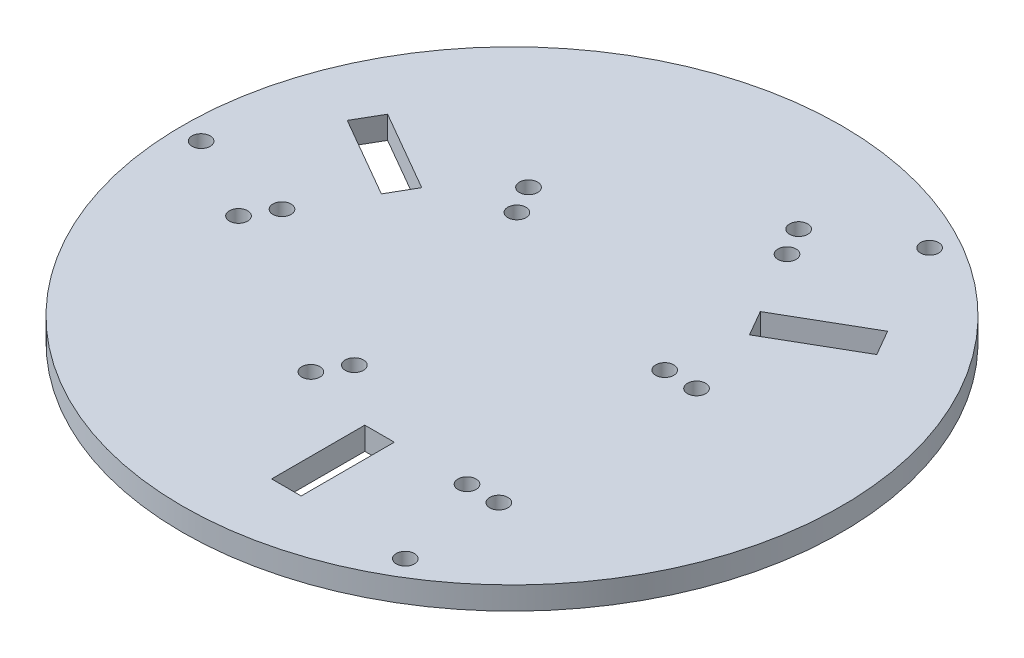
ISO-10303-21;
HEADER;
FILE_DESCRIPTION(('STEP AP214'),'2;1');
FILE_NAME('part.step','',(''),(''),'','','');
FILE_SCHEMA(('AUTOMOTIVE_DESIGN { 1 0 10303 214 1 1 1 1 }'));
ENDSEC;
DATA;
#1=APPLICATION_CONTEXT('core data for automotive mechanical design processes');
#2=APPLICATION_PROTOCOL_DEFINITION('international standard','automotive_design',2000,#1);
#3=PRODUCT_CONTEXT('',#1,'mechanical');
#4=PRODUCT('Part','Part','',(#3));
#5=PRODUCT_RELATED_PRODUCT_CATEGORY('part','',(#4));
#6=PRODUCT_DEFINITION_FORMATION('','',#4);
#7=PRODUCT_DEFINITION_CONTEXT('part definition',#1,'design');
#8=PRODUCT_DEFINITION('design','',#6,#7);
#9=PRODUCT_DEFINITION_SHAPE('','',#8);
#10=(LENGTH_UNIT() NAMED_UNIT(*) SI_UNIT(.MILLI.,.METRE.));
#11=(NAMED_UNIT(*) PLANE_ANGLE_UNIT() SI_UNIT($,.RADIAN.));
#12=(NAMED_UNIT(*) SI_UNIT($,.STERADIAN.) SOLID_ANGLE_UNIT());
#13=UNCERTAINTY_MEASURE_WITH_UNIT(LENGTH_MEASURE(1.E-05),#10,'distance_accuracy_value','');
#14=(GEOMETRIC_REPRESENTATION_CONTEXT(3) GLOBAL_UNCERTAINTY_ASSIGNED_CONTEXT((#13)) GLOBAL_UNIT_ASSIGNED_CONTEXT((#10,
#11,#12)) REPRESENTATION_CONTEXT('',''));
#15=CARTESIAN_POINT('',(0.,0.,0.));
#16=DIRECTION('',(0.,0.,1.));
#17=DIRECTION('',(1.,0.,0.));
#18=AXIS2_PLACEMENT_3D('',#15,#16,#17);
#19=CARTESIAN_POINT('',(0.,5.,0.));
#20=DIRECTION('',(0.,-1.,0.));
#21=DIRECTION('',(0.,0.,-1.));
#22=AXIS2_PLACEMENT_3D('',#19,#20,#21);
#23=CYLINDRICAL_SURFACE('',#22,72.5);
#24=CARTESIAN_POINT('',(0.,5.,0.));
#25=DIRECTION('',(0.,1.,0.));
#26=DIRECTION('',(0.,0.,1.));
#27=AXIS2_PLACEMENT_3D('',#24,#25,#26);
#28=CIRCLE('',#27,72.5);
#29=CARTESIAN_POINT('',(0.,5.,72.5));
#30=VERTEX_POINT('',#29);
#31=EDGE_CURVE('E11',#30,#30,#28,.T.);
#32=ORIENTED_EDGE('',*,*,#31,.F.);
#33=EDGE_LOOP('',(#32));
#34=FACE_BOUND('',#33,.T.);
#35=CARTESIAN_POINT('',(0.,0.,0.));
#36=DIRECTION('',(0.,1.,0.));
#37=DIRECTION('',(0.,0.,1.));
#38=AXIS2_PLACEMENT_3D('',#35,#36,#37);
#39=CIRCLE('',#38,72.5);
#40=CARTESIAN_POINT('',(0.,0.,72.5));
#41=VERTEX_POINT('',#40);
#42=EDGE_CURVE('E48',#41,#41,#39,.T.);
#43=ORIENTED_EDGE('',*,*,#42,.T.);
#44=EDGE_LOOP('',(#43));
#45=FACE_BOUND('',#44,.T.);
#46=ADVANCED_FACE('F45',(#34,#45),#23,.T.);
#47=CARTESIAN_POINT('',(0.,5.,0.));
#48=DIRECTION('',(0.,1.,0.));
#49=DIRECTION('',(0.,0.,1.));
#50=AXIS2_PLACEMENT_3D('',#47,#48,#49);
#51=PLANE('',#50);
#52=CARTESIAN_POINT('',(-67.4939627960778,5.,0.902765795580199));
#53=DIRECTION('',(0.,1.,0.));
#54=DIRECTION('',(0.866025403784436,0.,-0.500000000000004));
#55=AXIS2_PLACEMENT_3D('',#52,#53,#54);
#56=CIRCLE('',#55,2.00000000000001);
#57=CARTESIAN_POINT('',(-65.7619119885089,5.,-0.0972342044198145));
#58=VERTEX_POINT('',#57);
#59=EDGE_CURVE('E211',#58,#58,#56,.T.);
#60=ORIENTED_EDGE('',*,*,#59,.F.);
#61=EDGE_LOOP('',(#60));
#62=FACE_BOUND('',#61,.T.);
#63=CARTESIAN_POINT('',(34.1230669589468,5.,37.0214699700118));
#64=DIRECTION('',(0.,1.,0.));
#65=DIRECTION('',(-0.866025403784443,0.,-0.499999999999992));
#66=AXIS2_PLACEMENT_3D('',#63,#64,#65);
#67=CIRCLE('',#66,2.);
#68=CARTESIAN_POINT('',(32.3910161513779,5.,36.0214699700118));
#69=VERTEX_POINT('',#68);
#70=EDGE_CURVE('E202',#69,#69,#67,.T.);
#71=ORIENTED_EDGE('',*,*,#70,.F.);
#72=EDGE_LOOP('',(#71));
#73=FACE_BOUND('',#72,.T.);
#74=CARTESIAN_POINT('',(27.1230669589468,5.,37.0214699700119));
#75=DIRECTION('',(0.,1.,0.));
#76=DIRECTION('',(-0.866025403784443,0.,-0.499999999999992));
#77=AXIS2_PLACEMENT_3D('',#74,#75,#76);
#78=CIRCLE('',#77,2.00000000000001);
#79=CARTESIAN_POINT('',(25.3910161513779,5.,36.0214699700119));
#80=VERTEX_POINT('',#79);
#81=EDGE_CURVE('E193',#80,#80,#78,.T.);
#82=ORIENTED_EDGE('',*,*,#81,.F.);
#83=EDGE_LOOP('',(#82));
#84=FACE_BOUND('',#83,.T.);
#85=CARTESIAN_POINT('',(34.1230669589465,5.,-6.4785300299882));
#86=DIRECTION('',(0.,1.,0.));
#87=DIRECTION('',(-0.866025403784443,0.,-0.499999999999992));
#88=AXIS2_PLACEMENT_3D('',#85,#86,#87);
#89=CIRCLE('',#88,2.00000000000001);
#90=CARTESIAN_POINT('',(32.3910161513776,5.,-7.47853002998819));
#91=VERTEX_POINT('',#90);
#92=EDGE_CURVE('E203',#91,#91,#89,.T.);
#93=ORIENTED_EDGE('',*,*,#92,.F.);
#94=EDGE_LOOP('',(#93));
#95=FACE_BOUND('',#94,.T.);
#96=CARTESIAN_POINT('',(-45.6230669589464,5.,4.97853002998812));
#97=DIRECTION('',(0.,1.,0.));
#98=DIRECTION('',(0.866025403784436,0.,-0.500000000000004));
#99=AXIS2_PLACEMENT_3D('',#96,#97,#98);
#100=CIRCLE('',#99,2.00000000000001);
#101=CARTESIAN_POINT('',(-43.8910161513775,5.,3.97853002998811));
#102=VERTEX_POINT('',#101);
#103=EDGE_CURVE('E276',#102,#102,#100,.T.);
#104=ORIENTED_EDGE('',*,*,#103,.F.);
#105=EDGE_LOOP('',(#104));
#106=FACE_BOUND('',#105,.T.);
#107=CARTESIAN_POINT('',(-11.4509618943233,5.,32.7907078564791));
#108=DIRECTION('',(0.,1.,0.));
#109=DIRECTION('',(0.866025403784436,0.,-0.500000000000004));
#110=AXIS2_PLACEMENT_3D('',#107,#108,#109);
#111=CIRCLE('',#110,2.00000000000001);
#112=CARTESIAN_POINT('',(-9.71891108675438,5.,31.7907078564791));
#113=VERTEX_POINT('',#112);
#114=EDGE_CURVE('E236',#113,#113,#111,.T.);
#115=ORIENTED_EDGE('',*,*,#114,.F.);
#116=EDGE_LOOP('',(#115));
#117=FACE_BOUND('',#116,.T.);
#118=CARTESIAN_POINT('',(-7.95096189432327,5.,26.728530029988));
#119=DIRECTION('',(0.,1.,0.));
#120=DIRECTION('',(0.866025403784436,0.,-0.500000000000004));
#121=AXIS2_PLACEMENT_3D('',#118,#119,#120);
#122=CIRCLE('',#121,1.99999999999999);
#123=CARTESIAN_POINT('',(-6.2189110867544,5.,25.728530029988));
#124=VERTEX_POINT('',#123);
#125=EDGE_CURVE('E227',#124,#124,#122,.T.);
#126=ORIENTED_EDGE('',*,*,#125,.F.);
#127=EDGE_LOOP('',(#126));
#128=FACE_BOUND('',#127,.T.);
#129=DIRECTION('',(0.499999999999967,0.,-0.866025403784458));
#130=VECTOR('',#129,1.);
#131=CARTESIAN_POINT('',(-37.60959373656,5.,-8.87009766199126));
#132=LINE('',#131,#130);
#133=CARTESIAN_POINT('',(-37.60959373656,5.,-8.87009766199126));
#134=VERTEX_POINT('',#133);
#135=CARTESIAN_POINT('',(-34.3595937365602,5.,-14.4992627865902));
#136=VERTEX_POINT('',#135);
#137=EDGE_CURVE('E60',#134,#136,#132,.T.);
#138=ORIENTED_EDGE('',*,*,#137,.F.);
#139=DIRECTION('',(0.86602540378444,0.,0.499999999999998));
#140=VECTOR('',#139,1.);
#141=CARTESIAN_POINT('',(-37.60959373656,5.,-8.87009766199126));
#142=LINE('',#141,#140);
#143=CARTESIAN_POINT('',(-55.3631145141412,5.,-19.1200976619913));
#144=VERTEX_POINT('',#143);
#145=EDGE_CURVE('E257',#144,#134,#142,.T.);
#146=ORIENTED_EDGE('',*,*,#145,.F.);
#147=DIRECTION('',(-0.500000000000032,0.,0.86602540378442));
#148=VECTOR('',#147,1.);
#149=CARTESIAN_POINT('',(-55.3631145141412,5.,-19.1200976619913));
#150=LINE('',#149,#148);
#151=CARTESIAN_POINT('',(-52.113114514141,5.,-24.7492627865901));
#152=VERTEX_POINT('',#151);
#153=EDGE_CURVE('E253',#152,#144,#150,.T.);
#154=ORIENTED_EDGE('',*,*,#153,.F.);
#155=DIRECTION('',(-0.866025403784439,0.,-0.499999999999999));
#156=VECTOR('',#155,1.);
#157=CARTESIAN_POINT('',(-34.3595937365602,5.,-14.4992627865902));
#158=LINE('',#157,#156);
#159=EDGE_CURVE('E249',#136,#152,#158,.T.);
#160=ORIENTED_EDGE('',*,*,#159,.F.);
#161=EDGE_LOOP('',(#138,#146,#154,#160));
#162=FACE_BOUND('',#161,.T.);
#163=CARTESIAN_POINT('',(27.1230669589465,5.,-6.47853002998816));
#164=DIRECTION('',(0.,1.,0.));
#165=DIRECTION('',(-0.866025403784443,0.,-0.499999999999992));
#166=AXIS2_PLACEMENT_3D('',#163,#164,#165);
#167=CIRCLE('',#166,1.99999999999999);
#168=CARTESIAN_POINT('',(25.3910161513776,5.,-7.47853002998814));
#169=VERTEX_POINT('',#168);
#170=EDGE_CURVE('E152',#169,#169,#167,.T.);
#171=ORIENTED_EDGE('',*,*,#170,.F.);
#172=EDGE_LOOP('',(#171));
#173=FACE_BOUND('',#172,.T.);
#174=DIRECTION('',(-1.,0.,0.));
#175=VECTOR('',#174,1.);
#176=CARTESIAN_POINT('',(11.1230669589468,5.,37.0059124328686));
#177=LINE('',#176,#175);
#178=CARTESIAN_POINT('',(11.1230669589468,5.,37.0059124328686));
#179=VERTEX_POINT('',#178);
#180=CARTESIAN_POINT('',(4.62306695894678,5.,37.0059124328689));
#181=VERTEX_POINT('',#180);
#182=EDGE_CURVE('E68',#179,#181,#177,.T.);
#183=ORIENTED_EDGE('',*,*,#182,.F.);
#184=DIRECTION('',(0.,0.,-1.));
#185=VECTOR('',#184,1.);
#186=CARTESIAN_POINT('',(11.1230669589468,5.,37.0059124328686));
#187=LINE('',#186,#185);
#188=CARTESIAN_POINT('',(11.1230669589469,5.,57.5059124328689));
#189=VERTEX_POINT('',#188);
#190=EDGE_CURVE('E143',#189,#179,#187,.T.);
#191=ORIENTED_EDGE('',*,*,#190,.F.);
#192=DIRECTION('',(1.,0.,0.));
#193=VECTOR('',#192,1.);
#194=CARTESIAN_POINT('',(11.1230669589469,5.,57.5059124328689));
#195=LINE('',#194,#193);
#196=CARTESIAN_POINT('',(4.6230669589469,5.,57.5059124328687));
#197=VERTEX_POINT('',#196);
#198=EDGE_CURVE('E171',#197,#189,#195,.T.);
#199=ORIENTED_EDGE('',*,*,#198,.F.);
#200=DIRECTION('',(0.,0.,1.));
#201=VECTOR('',#200,1.);
#202=CARTESIAN_POINT('',(4.62306695894678,5.,37.0059124328689));
#203=LINE('',#202,#201);
#204=EDGE_CURVE('E163',#181,#197,#203,.T.);
#205=ORIENTED_EDGE('',*,*,#204,.F.);
#206=EDGE_LOOP('',(#183,#191,#199,#205));
#207=FACE_BOUND('',#206,.T.);
#208=CARTESIAN_POINT('',(34.5287995106793,5.,58.0001034856949));
#209=DIRECTION('',(0.,1.,0.));
#210=DIRECTION('',(-0.866025403784443,0.,-0.499999999999992));
#211=AXIS2_PLACEMENT_3D('',#208,#209,#210);
#212=CIRCLE('',#211,2.00000000000001);
#213=CARTESIAN_POINT('',(32.7967487031104,5.,57.0001034856949));
#214=VERTEX_POINT('',#213);
#215=EDGE_CURVE('E185',#214,#214,#212,.T.);
#216=ORIENTED_EDGE('',*,*,#215,.F.);
#217=EDGE_LOOP('',(#216));
#218=FACE_BOUND('',#217,.T.);
#219=CARTESIAN_POINT('',(-49.1230669589464,5.,11.0407078564792));
#220=DIRECTION('',(0.,1.,0.));
#221=DIRECTION('',(0.866025403784436,0.,-0.500000000000004));
#222=AXIS2_PLACEMENT_3D('',#219,#220,#221);
#223=CIRCLE('',#222,2.);
#224=CARTESIAN_POINT('',(-47.3910161513775,5.,10.0407078564792));
#225=VERTEX_POINT('',#224);
#226=EDGE_CURVE('E285',#225,#225,#223,.T.);
#227=ORIENTED_EDGE('',*,*,#226,.F.);
#228=EDGE_LOOP('',(#227));
#229=FACE_BOUND('',#228,.T.);
#230=CARTESIAN_POINT('',(32.965163285399,5.,-58.9028692812751));
#231=DIRECTION('',(0.,1.,0.));
#232=DIRECTION('',(0.,0.,1.));
#233=AXIS2_PLACEMENT_3D('',#230,#231,#232);
#234=CIRCLE('',#233,2.00000000000001);
#235=CARTESIAN_POINT('',(32.965163285399,5.,-56.9028692812751));
#236=VERTEX_POINT('',#235);
#237=EDGE_CURVE('E315',#236,#236,#234,.T.);
#238=ORIENTED_EDGE('',*,*,#237,.F.);
#239=EDGE_LOOP('',(#238));
#240=FACE_BOUND('',#239,.T.);
#241=CARTESIAN_POINT('',(18.5,5.,-42.));
#242=DIRECTION('',(0.,1.,0.));
#243=DIRECTION('',(0.,0.,1.));
#244=AXIS2_PLACEMENT_3D('',#241,#242,#243);
#245=CIRCLE('',#244,2.00000000000001);
#246=CARTESIAN_POINT('',(18.5,5.,-40.));
#247=VERTEX_POINT('',#246);
#248=EDGE_CURVE('E357',#247,#247,#245,.T.);
#249=ORIENTED_EDGE('',*,*,#248,.F.);
#250=EDGE_LOOP('',(#249));
#251=FACE_BOUND('',#250,.T.);
#252=CARTESIAN_POINT('',(-22.6721050646231,5.,-26.3121778264912));
#253=DIRECTION('',(0.,1.,0.));
#254=DIRECTION('',(0.,0.,1.));
#255=AXIS2_PLACEMENT_3D('',#252,#253,#254);
#256=CIRCLE('',#255,2.00000000000001);
#257=CARTESIAN_POINT('',(-22.6721050646231,5.,-24.3121778264912));
#258=VERTEX_POINT('',#257);
#259=EDGE_CURVE('E358',#258,#258,#256,.T.);
#260=ORIENTED_EDGE('',*,*,#259,.F.);
#261=EDGE_LOOP('',(#260));
#262=FACE_BOUND('',#261,.T.);
#263=CARTESIAN_POINT('',(-19.1721050646232,5.,-20.2500000000001));
#264=DIRECTION('',(0.,1.,0.));
#265=DIRECTION('',(0.,0.,1.));
#266=AXIS2_PLACEMENT_3D('',#263,#264,#265);
#267=CIRCLE('',#266,1.99999999999999);
#268=CARTESIAN_POINT('',(-19.1721050646232,5.,-18.2500000000001));
#269=VERTEX_POINT('',#268);
#270=EDGE_CURVE('E304',#269,#269,#267,.T.);
#271=ORIENTED_EDGE('',*,*,#270,.F.);
#272=EDGE_LOOP('',(#271));
#273=FACE_BOUND('',#272,.T.);
#274=DIRECTION('',(0.500000000000029,0.,0.866025403784422));
#275=VECTOR('',#274,1.);
#276=CARTESIAN_POINT('',(26.4865267776135,5.,-28.1358147708773));
#277=LINE('',#276,#275);
#278=CARTESIAN_POINT('',(26.4865267776135,5.,-28.1358147708773));
#279=VERTEX_POINT('',#278);
#280=CARTESIAN_POINT('',(29.7365267776137,5.,-22.5066496462786));
#281=VERTEX_POINT('',#280);
#282=EDGE_CURVE('E340',#279,#281,#277,.T.);
#283=ORIENTED_EDGE('',*,*,#282,.F.);
#284=DIRECTION('',(-0.86602540378444,0.,0.499999999999998));
#285=VECTOR('',#284,1.);
#286=CARTESIAN_POINT('',(26.4865267776135,5.,-28.1358147708773));
#287=LINE('',#286,#285);
#288=CARTESIAN_POINT('',(44.2400475551947,5.,-38.3858147708774));
#289=VERTEX_POINT('',#288);
#290=EDGE_CURVE('E320',#289,#279,#287,.T.);
#291=ORIENTED_EDGE('',*,*,#290,.F.);
#292=DIRECTION('',(-0.499999999999964,0.,-0.86602540378446));
#293=VECTOR('',#292,1.);
#294=CARTESIAN_POINT('',(44.2400475551947,5.,-38.3858147708774));
#295=LINE('',#294,#293);
#296=CARTESIAN_POINT('',(47.4900475551945,5.,-32.7566496462784));
#297=VERTEX_POINT('',#296);
#298=EDGE_CURVE('E332',#297,#289,#295,.T.);
#299=ORIENTED_EDGE('',*,*,#298,.F.);
#300=DIRECTION('',(0.86602540378444,0.,-0.499999999999997));
#301=VECTOR('',#300,1.);
#302=CARTESIAN_POINT('',(29.7365267776137,5.,-22.5066496462786));
#303=LINE('',#302,#301);
#304=EDGE_CURVE('E336',#281,#297,#303,.T.);
#305=ORIENTED_EDGE('',*,*,#304,.F.);
#306=EDGE_LOOP('',(#283,#291,#299,#305));
#307=FACE_BOUND('',#306,.T.);
#308=CARTESIAN_POINT('',(15.,5.,-48.0621778264911));
#309=DIRECTION('',(0.,1.,0.));
#310=DIRECTION('',(0.,0.,1.));
#311=AXIS2_PLACEMENT_3D('',#308,#309,#310);
#312=CIRCLE('',#311,2.);
#313=CARTESIAN_POINT('',(15.,5.,-46.0621778264911));
#314=VERTEX_POINT('',#313);
#315=EDGE_CURVE('E362',#314,#314,#312,.T.);
#316=ORIENTED_EDGE('',*,*,#315,.F.);
#317=EDGE_LOOP('',(#316));
#318=FACE_BOUND('',#317,.T.);
#319=ORIENTED_EDGE('',*,*,#31,.T.);
#320=EDGE_LOOP('',(#319));
#321=FACE_BOUND('',#320,.T.);
#322=ADVANCED_FACE('F390',(#62,#73,#84,#95,#106,#117,#128,#162,#173,#207,#218,#229,#240,#251,
#262,#273,#307,#318,#321),#51,.T.);
#323=CARTESIAN_POINT('',(0.,0.,0.));
#324=DIRECTION('',(0.,1.,0.));
#325=DIRECTION('',(0.,0.,1.));
#326=AXIS2_PLACEMENT_3D('',#323,#324,#325);
#327=PLANE('',#326);
#328=CARTESIAN_POINT('',(-67.4939627960778,0.,0.902765795580199));
#329=DIRECTION('',(0.,1.,0.));
#330=DIRECTION('',(0.,0.,1.));
#331=AXIS2_PLACEMENT_3D('',#328,#329,#330);
#332=CIRCLE('',#331,2.00000000000001);
#333=CARTESIAN_POINT('',(-67.4939627960778,0.,2.90276579558021));
#334=VERTEX_POINT('',#333);
#335=EDGE_CURVE('E215',#334,#334,#332,.F.);
#336=ORIENTED_EDGE('',*,*,#335,.F.);
#337=EDGE_LOOP('',(#336));
#338=FACE_BOUND('',#337,.T.);
#339=CARTESIAN_POINT('',(34.1230669589468,0.,37.0214699700118));
#340=DIRECTION('',(0.,1.,0.));
#341=DIRECTION('',(0.,0.,1.));
#342=AXIS2_PLACEMENT_3D('',#339,#340,#341);
#343=CIRCLE('',#342,2.);
#344=CARTESIAN_POINT('',(34.1230669589468,0.,39.0214699700118));
#345=VERTEX_POINT('',#344);
#346=EDGE_CURVE('E216',#345,#345,#343,.F.);
#347=ORIENTED_EDGE('',*,*,#346,.F.);
#348=EDGE_LOOP('',(#347));
#349=FACE_BOUND('',#348,.T.);
#350=CARTESIAN_POINT('',(27.1230669589468,0.,37.0214699700119));
#351=DIRECTION('',(0.,1.,0.));
#352=DIRECTION('',(0.,0.,1.));
#353=AXIS2_PLACEMENT_3D('',#350,#351,#352);
#354=CIRCLE('',#353,2.00000000000001);
#355=CARTESIAN_POINT('',(27.1230669589468,0.,39.0214699700119));
#356=VERTEX_POINT('',#355);
#357=EDGE_CURVE('E197',#356,#356,#354,.F.);
#358=ORIENTED_EDGE('',*,*,#357,.F.);
#359=EDGE_LOOP('',(#358));
#360=FACE_BOUND('',#359,.T.);
#361=CARTESIAN_POINT('',(34.1230669589465,0.,-6.4785300299882));
#362=DIRECTION('',(0.,1.,0.));
#363=DIRECTION('',(0.,0.,1.));
#364=AXIS2_PLACEMENT_3D('',#361,#362,#363);
#365=CIRCLE('',#364,2.00000000000001);
#366=CARTESIAN_POINT('',(34.1230669589465,0.,-4.47853002998819));
#367=VERTEX_POINT('',#366);
#368=EDGE_CURVE('E198',#367,#367,#365,.F.);
#369=ORIENTED_EDGE('',*,*,#368,.F.);
#370=EDGE_LOOP('',(#369));
#371=FACE_BOUND('',#370,.T.);
#372=CARTESIAN_POINT('',(-45.6230669589464,0.,4.97853002998812));
#373=DIRECTION('',(0.,1.,0.));
#374=DIRECTION('',(0.,0.,1.));
#375=AXIS2_PLACEMENT_3D('',#372,#373,#374);
#376=CIRCLE('',#375,2.00000000000001);
#377=CARTESIAN_POINT('',(-45.6230669589464,0.,6.97853002998812));
#378=VERTEX_POINT('',#377);
#379=EDGE_CURVE('E280',#378,#378,#376,.F.);
#380=ORIENTED_EDGE('',*,*,#379,.F.);
#381=EDGE_LOOP('',(#380));
#382=FACE_BOUND('',#381,.T.);
#383=CARTESIAN_POINT('',(-11.4509618943233,0.,32.7907078564791));
#384=DIRECTION('',(0.,1.,0.));
#385=DIRECTION('',(0.,0.,1.));
#386=AXIS2_PLACEMENT_3D('',#383,#384,#385);
#387=CIRCLE('',#386,2.00000000000001);
#388=CARTESIAN_POINT('',(-11.4509618943233,0.,34.7907078564791));
#389=VERTEX_POINT('',#388);
#390=EDGE_CURVE('E281',#389,#389,#387,.F.);
#391=ORIENTED_EDGE('',*,*,#390,.F.);
#392=EDGE_LOOP('',(#391));
#393=FACE_BOUND('',#392,.T.);
#394=CARTESIAN_POINT('',(-7.95096189432327,0.,26.728530029988));
#395=DIRECTION('',(0.,1.,0.));
#396=DIRECTION('',(0.,0.,1.));
#397=AXIS2_PLACEMENT_3D('',#394,#395,#396);
#398=CIRCLE('',#397,1.99999999999999);
#399=CARTESIAN_POINT('',(-7.95096189432327,0.,28.728530029988));
#400=VERTEX_POINT('',#399);
#401=EDGE_CURVE('E231',#400,#400,#398,.F.);
#402=ORIENTED_EDGE('',*,*,#401,.F.);
#403=EDGE_LOOP('',(#402));
#404=FACE_BOUND('',#403,.T.);
#405=DIRECTION('',(-0.86602540378444,0.,-0.499999999999998));
#406=VECTOR('',#405,1.);
#407=CARTESIAN_POINT('',(-37.60959373656,0.,-8.87009766199126));
#408=LINE('',#407,#406);
#409=CARTESIAN_POINT('',(-37.60959373656,0.,-8.87009766199126));
#410=VERTEX_POINT('',#409);
#411=CARTESIAN_POINT('',(-55.3631145141412,0.,-19.1200976619913));
#412=VERTEX_POINT('',#411);
#413=EDGE_CURVE('E239',#410,#412,#408,.T.);
#414=ORIENTED_EDGE('',*,*,#413,.F.);
#415=DIRECTION('',(-0.499999999999967,0.,0.866025403784458));
#416=VECTOR('',#415,1.);
#417=CARTESIAN_POINT('',(-37.60959373656,0.,-8.87009766199126));
#418=LINE('',#417,#416);
#419=CARTESIAN_POINT('',(-34.3595937365602,0.,-14.4992627865902));
#420=VERTEX_POINT('',#419);
#421=EDGE_CURVE('E243',#420,#410,#418,.T.);
#422=ORIENTED_EDGE('',*,*,#421,.F.);
#423=DIRECTION('',(0.866025403784439,0.,0.499999999999999));
#424=VECTOR('',#423,1.);
#425=CARTESIAN_POINT('',(-34.3595937365602,0.,-14.4992627865902));
#426=LINE('',#425,#424);
#427=CARTESIAN_POINT('',(-52.113114514141,0.,-24.7492627865901));
#428=VERTEX_POINT('',#427);
#429=EDGE_CURVE('E232',#428,#420,#426,.T.);
#430=ORIENTED_EDGE('',*,*,#429,.F.);
#431=DIRECTION('',(0.500000000000032,0.,-0.86602540378442));
#432=VECTOR('',#431,1.);
#433=CARTESIAN_POINT('',(-55.3631145141412,0.,-19.1200976619913));
#434=LINE('',#433,#432);
#435=EDGE_CURVE('E220',#412,#428,#434,.T.);
#436=ORIENTED_EDGE('',*,*,#435,.F.);
#437=EDGE_LOOP('',(#414,#422,#430,#436));
#438=FACE_BOUND('',#437,.T.);
#439=CARTESIAN_POINT('',(27.1230669589465,0.,-6.47853002998816));
#440=DIRECTION('',(0.,1.,0.));
#441=DIRECTION('',(0.,0.,1.));
#442=AXIS2_PLACEMENT_3D('',#439,#440,#441);
#443=CIRCLE('',#442,1.99999999999999);
#444=CARTESIAN_POINT('',(27.1230669589465,0.,-4.47853002998817));
#445=VERTEX_POINT('',#444);
#446=EDGE_CURVE('E207',#445,#445,#443,.F.);
#447=ORIENTED_EDGE('',*,*,#446,.F.);
#448=EDGE_LOOP('',(#447));
#449=FACE_BOUND('',#448,.T.);
#450=DIRECTION('',(0.,0.,1.));
#451=VECTOR('',#450,1.);
#452=CARTESIAN_POINT('',(11.1230669589468,0.,37.0059124328686));
#453=LINE('',#452,#451);
#454=CARTESIAN_POINT('',(11.1230669589468,0.,37.0059124328686));
#455=VERTEX_POINT('',#454);
#456=CARTESIAN_POINT('',(11.1230669589469,0.,57.5059124328689));
#457=VERTEX_POINT('',#456);
#458=EDGE_CURVE('E158',#455,#457,#453,.T.);
#459=ORIENTED_EDGE('',*,*,#458,.F.);
#460=DIRECTION('',(1.,0.,0.));
#461=VECTOR('',#460,1.);
#462=CARTESIAN_POINT('',(11.1230669589468,0.,37.0059124328686));
#463=LINE('',#462,#461);
#464=CARTESIAN_POINT('',(4.62306695894678,0.,37.0059124328689));
#465=VERTEX_POINT('',#464);
#466=EDGE_CURVE('E136',#465,#455,#463,.T.);
#467=ORIENTED_EDGE('',*,*,#466,.F.);
#468=DIRECTION('',(0.,0.,-1.));
#469=VECTOR('',#468,1.);
#470=CARTESIAN_POINT('',(4.62306695894678,0.,37.0059124328689));
#471=LINE('',#470,#469);
#472=CARTESIAN_POINT('',(4.6230669589469,0.,57.5059124328687));
#473=VERTEX_POINT('',#472);
#474=EDGE_CURVE('E147',#473,#465,#471,.T.);
#475=ORIENTED_EDGE('',*,*,#474,.F.);
#476=DIRECTION('',(-1.,0.,0.));
#477=VECTOR('',#476,1.);
#478=CARTESIAN_POINT('',(11.1230669589469,0.,57.5059124328689));
#479=LINE('',#478,#477);
#480=EDGE_CURVE('E165',#457,#473,#479,.T.);
#481=ORIENTED_EDGE('',*,*,#480,.F.);
#482=EDGE_LOOP('',(#459,#467,#475,#481));
#483=FACE_BOUND('',#482,.T.);
#484=CARTESIAN_POINT('',(34.5287995106793,0.,58.0001034856949));
#485=DIRECTION('',(0.,1.,0.));
#486=DIRECTION('',(0.,0.,1.));
#487=AXIS2_PLACEMENT_3D('',#484,#485,#486);
#488=CIRCLE('',#487,2.00000000000001);
#489=CARTESIAN_POINT('',(34.5287995106793,0.,60.0001034856949));
#490=VERTEX_POINT('',#489);
#491=EDGE_CURVE('E189',#490,#490,#488,.F.);
#492=ORIENTED_EDGE('',*,*,#491,.F.);
#493=EDGE_LOOP('',(#492));
#494=FACE_BOUND('',#493,.T.);
#495=CARTESIAN_POINT('',(-49.1230669589464,0.,11.0407078564792));
#496=DIRECTION('',(0.,1.,0.));
#497=DIRECTION('',(0.,0.,1.));
#498=AXIS2_PLACEMENT_3D('',#495,#496,#497);
#499=CIRCLE('',#498,2.);
#500=CARTESIAN_POINT('',(-49.1230669589464,0.,13.0407078564792));
#501=VERTEX_POINT('',#500);
#502=EDGE_CURVE('E295',#501,#501,#499,.F.);
#503=ORIENTED_EDGE('',*,*,#502,.F.);
#504=EDGE_LOOP('',(#503));
#505=FACE_BOUND('',#504,.T.);
#506=CARTESIAN_POINT('',(32.965163285399,0.,-58.9028692812751));
#507=DIRECTION('',(0.,1.,0.));
#508=DIRECTION('',(0.,0.,1.));
#509=AXIS2_PLACEMENT_3D('',#506,#507,#508);
#510=CIRCLE('',#509,2.00000000000001);
#511=CARTESIAN_POINT('',(32.965163285399,0.,-56.9028692812751));
#512=VERTEX_POINT('',#511);
#513=EDGE_CURVE('E299',#512,#512,#510,.F.);
#514=ORIENTED_EDGE('',*,*,#513,.F.);
#515=EDGE_LOOP('',(#514));
#516=FACE_BOUND('',#515,.T.);
#517=CARTESIAN_POINT('',(18.5,0.,-42.));
#518=DIRECTION('',(0.,1.,0.));
#519=DIRECTION('',(0.,0.,1.));
#520=AXIS2_PLACEMENT_3D('',#517,#518,#519);
#521=CIRCLE('',#520,2.00000000000001);
#522=CARTESIAN_POINT('',(18.5,0.,-40.));
#523=VERTEX_POINT('',#522);
#524=EDGE_CURVE('E353',#523,#523,#521,.F.);
#525=ORIENTED_EDGE('',*,*,#524,.F.);
#526=EDGE_LOOP('',(#525));
#527=FACE_BOUND('',#526,.T.);
#528=CARTESIAN_POINT('',(-22.6721050646231,0.,-26.3121778264912));
#529=DIRECTION('',(0.,1.,0.));
#530=DIRECTION('',(0.,0.,1.));
#531=AXIS2_PLACEMENT_3D('',#528,#529,#530);
#532=CIRCLE('',#531,2.00000000000001);
#533=CARTESIAN_POINT('',(-22.6721050646231,0.,-24.3121778264912));
#534=VERTEX_POINT('',#533);
#535=EDGE_CURVE('E309',#534,#534,#532,.F.);
#536=ORIENTED_EDGE('',*,*,#535,.F.);
#537=EDGE_LOOP('',(#536));
#538=FACE_BOUND('',#537,.T.);
#539=CARTESIAN_POINT('',(-19.1721050646232,0.,-20.2500000000001));
#540=DIRECTION('',(0.,1.,0.));
#541=DIRECTION('',(0.,0.,1.));
#542=AXIS2_PLACEMENT_3D('',#539,#540,#541);
#543=CIRCLE('',#542,1.99999999999999);
#544=CARTESIAN_POINT('',(-19.1721050646232,0.,-18.2500000000001));
#545=VERTEX_POINT('',#544);
#546=EDGE_CURVE('E300',#545,#545,#543,.F.);
#547=ORIENTED_EDGE('',*,*,#546,.F.);
#548=EDGE_LOOP('',(#547));
#549=FACE_BOUND('',#548,.T.);
#550=DIRECTION('',(0.86602540378444,0.,-0.499999999999998));
#551=VECTOR('',#550,1.);
#552=CARTESIAN_POINT('',(26.4865267776135,0.,-28.1358147708773));
#553=LINE('',#552,#551);
#554=CARTESIAN_POINT('',(26.4865267776135,0.,-28.1358147708773));
#555=VERTEX_POINT('',#554);
#556=CARTESIAN_POINT('',(44.2400475551947,0.,-38.3858147708774));
#557=VERTEX_POINT('',#556);
#558=EDGE_CURVE('E347',#555,#557,#553,.T.);
#559=ORIENTED_EDGE('',*,*,#558,.F.);
#560=DIRECTION('',(-0.50000000000003,0.,-0.866025403784422));
#561=VECTOR('',#560,1.);
#562=CARTESIAN_POINT('',(26.4865267776135,0.,-28.1358147708773));
#563=LINE('',#562,#561);
#564=CARTESIAN_POINT('',(29.7365267776137,0.,-22.5066496462786));
#565=VERTEX_POINT('',#564);
#566=EDGE_CURVE('E343',#565,#555,#563,.T.);
#567=ORIENTED_EDGE('',*,*,#566,.F.);
#568=DIRECTION('',(-0.86602540378444,0.,0.499999999999997));
#569=VECTOR('',#568,1.);
#570=CARTESIAN_POINT('',(29.7365267776137,0.,-22.5066496462786));
#571=LINE('',#570,#569);
#572=CARTESIAN_POINT('',(47.4900475551945,0.,-32.7566496462784));
#573=VERTEX_POINT('',#572);
#574=EDGE_CURVE('E310',#573,#565,#571,.T.);
#575=ORIENTED_EDGE('',*,*,#574,.F.);
#576=DIRECTION('',(0.499999999999964,0.,0.86602540378446));
#577=VECTOR('',#576,1.);
#578=CARTESIAN_POINT('',(44.2400475551947,0.,-38.3858147708774));
#579=LINE('',#578,#577);
#580=EDGE_CURVE('E305',#557,#573,#579,.T.);
#581=ORIENTED_EDGE('',*,*,#580,.F.);
#582=EDGE_LOOP('',(#559,#567,#575,#581));
#583=FACE_BOUND('',#582,.T.);
#584=CARTESIAN_POINT('',(15.,0.,-48.0621778264911));
#585=DIRECTION('',(0.,1.,0.));
#586=DIRECTION('',(0.,0.,1.));
#587=AXIS2_PLACEMENT_3D('',#584,#585,#586);
#588=CIRCLE('',#587,2.);
#589=CARTESIAN_POINT('',(15.,0.,-46.0621778264911));
#590=VERTEX_POINT('',#589);
#591=EDGE_CURVE('E378',#590,#590,#588,.F.);
#592=ORIENTED_EDGE('',*,*,#591,.F.);
#593=EDGE_LOOP('',(#592));
#594=FACE_BOUND('',#593,.T.);
#595=ORIENTED_EDGE('',*,*,#42,.F.);
#596=EDGE_LOOP('',(#595));
#597=FACE_BOUND('',#596,.T.);
#598=ADVANCED_FACE('F155',(#338,#349,#360,#371,#382,#393,#404,#438,#449,#483,#494,#505,#516,
#527,#538,#549,#583,#594,#597),#327,.F.);
#599=CARTESIAN_POINT('',(15.,-0.00100000000000013,-48.0621778264911));
#600=DIRECTION('',(0.,1.,0.));
#601=DIRECTION('',(0.,0.,1.));
#602=AXIS2_PLACEMENT_3D('',#599,#600,#601);
#603=CYLINDRICAL_SURFACE('',#602,2.);
#604=ORIENTED_EDGE('',*,*,#315,.T.);
#605=EDGE_LOOP('',(#604));
#606=FACE_BOUND('',#605,.T.);
#607=ORIENTED_EDGE('',*,*,#591,.T.);
#608=EDGE_LOOP('',(#607));
#609=FACE_BOUND('',#608,.T.);
#610=ADVANCED_FACE('F389',(#606,#609),#603,.F.);
#611=CARTESIAN_POINT('',(26.4865267776135,-0.00100000000000013,-28.1358147708773));
#612=DIRECTION('',(-0.866025403784422,0.,0.500000000000029));
#613=DIRECTION('',(0.50000000000003,0.,0.866025403784422));
#614=AXIS2_PLACEMENT_3D('',#611,#612,#613);
#615=PLANE('',#614);
#616=ORIENTED_EDGE('',*,*,#566,.T.);
#617=DIRECTION('',(0.,1.,0.));
#618=VECTOR('',#617,1.);
#619=CARTESIAN_POINT('',(26.4865267776135,-0.00100000000000013,-28.1358147708773));
#620=LINE('',#619,#618);
#621=EDGE_CURVE('E314',#555,#279,#620,.T.);
#622=ORIENTED_EDGE('',*,*,#621,.T.);
#623=ORIENTED_EDGE('',*,*,#282,.T.);
#624=DIRECTION('',(0.,1.,0.));
#625=VECTOR('',#624,1.);
#626=CARTESIAN_POINT('',(29.7365267776137,-0.00100000000000013,-22.5066496462786));
#627=LINE('',#626,#625);
#628=EDGE_CURVE('E316',#565,#281,#627,.T.);
#629=ORIENTED_EDGE('',*,*,#628,.F.);
#630=EDGE_LOOP('',(#616,#622,#623,#629));
#631=FACE_BOUND('',#630,.T.);
#632=ADVANCED_FACE('F397',(#631),#615,.F.);
#633=CARTESIAN_POINT('',(26.4865267776135,-0.00100000000000013,-28.1358147708773));
#634=DIRECTION('',(-0.499999999999998,0.,-0.86602540378444));
#635=DIRECTION('',(-0.86602540378444,0.,0.499999999999998));
#636=AXIS2_PLACEMENT_3D('',#633,#634,#635);
#637=PLANE('',#636);
#638=ORIENTED_EDGE('',*,*,#558,.T.);
#639=DIRECTION('',(0.,1.,0.));
#640=VECTOR('',#639,1.);
#641=CARTESIAN_POINT('',(44.2400475551947,-0.00100000000000013,-38.3858147708774));
#642=LINE('',#641,#640);
#643=EDGE_CURVE('E324',#557,#289,#642,.T.);
#644=ORIENTED_EDGE('',*,*,#643,.T.);
#645=ORIENTED_EDGE('',*,*,#290,.T.);
#646=ORIENTED_EDGE('',*,*,#621,.F.);
#647=EDGE_LOOP('',(#638,#644,#645,#646));
#648=FACE_BOUND('',#647,.T.);
#649=ADVANCED_FACE('F423',(#648),#637,.F.);
#650=CARTESIAN_POINT('',(44.2400475551947,-0.00100000000000013,-38.3858147708774));
#651=DIRECTION('',(0.86602540378446,0.,-0.499999999999964));
#652=DIRECTION('',(-0.499999999999964,0.,-0.86602540378446));
#653=AXIS2_PLACEMENT_3D('',#650,#651,#652);
#654=PLANE('',#653);
#655=ORIENTED_EDGE('',*,*,#580,.T.);
#656=DIRECTION('',(0.,1.,0.));
#657=VECTOR('',#656,1.);
#658=CARTESIAN_POINT('',(47.4900475551945,-0.00100000000000013,-32.7566496462784));
#659=LINE('',#658,#657);
#660=EDGE_CURVE('E321',#573,#297,#659,.T.);
#661=ORIENTED_EDGE('',*,*,#660,.T.);
#662=ORIENTED_EDGE('',*,*,#298,.T.);
#663=ORIENTED_EDGE('',*,*,#643,.F.);
#664=EDGE_LOOP('',(#655,#661,#662,#663));
#665=FACE_BOUND('',#664,.T.);
#666=ADVANCED_FACE('F432',(#665),#654,.F.);
#667=CARTESIAN_POINT('',(29.7365267776137,-0.00100000000000013,-22.5066496462786));
#668=DIRECTION('',(0.499999999999997,0.,0.86602540378444));
#669=DIRECTION('',(0.86602540378444,0.,-0.499999999999997));
#670=AXIS2_PLACEMENT_3D('',#667,#668,#669);
#671=PLANE('',#670);
#672=ORIENTED_EDGE('',*,*,#574,.T.);
#673=ORIENTED_EDGE('',*,*,#628,.T.);
#674=ORIENTED_EDGE('',*,*,#304,.T.);
#675=ORIENTED_EDGE('',*,*,#660,.F.);
#676=EDGE_LOOP('',(#672,#673,#674,#675));
#677=FACE_BOUND('',#676,.T.);
#678=ADVANCED_FACE('F441',(#677),#671,.F.);
#679=CARTESIAN_POINT('',(-19.1721050646232,-0.00100000000000013,-20.2500000000001));
#680=DIRECTION('',(0.,1.,0.));
#681=DIRECTION('',(0.,0.,1.));
#682=AXIS2_PLACEMENT_3D('',#679,#680,#681);
#683=CYLINDRICAL_SURFACE('',#682,1.99999999999999);
#684=ORIENTED_EDGE('',*,*,#270,.T.);
#685=EDGE_LOOP('',(#684));
#686=FACE_BOUND('',#685,.T.);
#687=ORIENTED_EDGE('',*,*,#546,.T.);
#688=EDGE_LOOP('',(#687));
#689=FACE_BOUND('',#688,.T.);
#690=ADVANCED_FACE('F450',(#686,#689),#683,.F.);
#691=CARTESIAN_POINT('',(-22.6721050646231,-0.00100000000000013,-26.3121778264912));
#692=DIRECTION('',(0.,1.,0.));
#693=DIRECTION('',(0.,0.,1.));
#694=AXIS2_PLACEMENT_3D('',#691,#692,#693);
#695=CYLINDRICAL_SURFACE('',#694,2.00000000000001);
#696=ORIENTED_EDGE('',*,*,#259,.T.);
#697=EDGE_LOOP('',(#696));
#698=FACE_BOUND('',#697,.T.);
#699=ORIENTED_EDGE('',*,*,#535,.T.);
#700=EDGE_LOOP('',(#699));
#701=FACE_BOUND('',#700,.T.);
#702=ADVANCED_FACE('F459',(#698,#701),#695,.F.);
#703=CARTESIAN_POINT('',(18.5,-0.00100000000000013,-42.));
#704=DIRECTION('',(0.,1.,0.));
#705=DIRECTION('',(0.,0.,1.));
#706=AXIS2_PLACEMENT_3D('',#703,#704,#705);
#707=CYLINDRICAL_SURFACE('',#706,2.00000000000001);
#708=ORIENTED_EDGE('',*,*,#248,.T.);
#709=EDGE_LOOP('',(#708));
#710=FACE_BOUND('',#709,.T.);
#711=ORIENTED_EDGE('',*,*,#524,.T.);
#712=EDGE_LOOP('',(#711));
#713=FACE_BOUND('',#712,.T.);
#714=ADVANCED_FACE('F468',(#710,#713),#707,.F.);
#715=CARTESIAN_POINT('',(32.965163285399,-0.00100000000000013,-58.9028692812751));
#716=DIRECTION('',(0.,1.,0.));
#717=DIRECTION('',(0.,0.,1.));
#718=AXIS2_PLACEMENT_3D('',#715,#716,#717);
#719=CYLINDRICAL_SURFACE('',#718,2.00000000000001);
#720=ORIENTED_EDGE('',*,*,#237,.T.);
#721=EDGE_LOOP('',(#720));
#722=FACE_BOUND('',#721,.T.);
#723=ORIENTED_EDGE('',*,*,#513,.T.);
#724=EDGE_LOOP('',(#723));
#725=FACE_BOUND('',#724,.T.);
#726=ADVANCED_FACE('F477',(#722,#725),#719,.F.);
#727=CARTESIAN_POINT('',(-49.1230669589464,-0.00100000000000013,11.0407078564792));
#728=DIRECTION('',(0.,1.,0.));
#729=DIRECTION('',(0.,0.,1.));
#730=AXIS2_PLACEMENT_3D('',#727,#728,#729);
#731=CYLINDRICAL_SURFACE('',#730,2.);
#732=ORIENTED_EDGE('',*,*,#226,.T.);
#733=EDGE_LOOP('',(#732));
#734=FACE_BOUND('',#733,.T.);
#735=ORIENTED_EDGE('',*,*,#502,.T.);
#736=EDGE_LOOP('',(#735));
#737=FACE_BOUND('',#736,.T.);
#738=ADVANCED_FACE('F485',(#734,#737),#731,.F.);
#739=CARTESIAN_POINT('',(34.5287995106793,-0.00100000000000013,58.0001034856949));
#740=DIRECTION('',(0.,1.,0.));
#741=DIRECTION('',(0.,0.,1.));
#742=AXIS2_PLACEMENT_3D('',#739,#740,#741);
#743=CYLINDRICAL_SURFACE('',#742,2.00000000000001);
#744=ORIENTED_EDGE('',*,*,#215,.T.);
#745=EDGE_LOOP('',(#744));
#746=FACE_BOUND('',#745,.T.);
#747=ORIENTED_EDGE('',*,*,#491,.T.);
#748=EDGE_LOOP('',(#747));
#749=FACE_BOUND('',#748,.T.);
#750=ADVANCED_FACE('F513',(#746,#749),#743,.F.);
#751=CARTESIAN_POINT('',(11.1230669589468,-0.00100000000000013,37.0059124328686));
#752=DIRECTION('',(0.,0.,-1.));
#753=DIRECTION('',(-1.,0.,0.));
#754=AXIS2_PLACEMENT_3D('',#751,#752,#753);
#755=PLANE('',#754);
#756=ORIENTED_EDGE('',*,*,#466,.T.);
#757=DIRECTION('',(0.,1.,0.));
#758=VECTOR('',#757,1.);
#759=CARTESIAN_POINT('',(11.1230669589468,-0.00100000000000013,37.0059124328686));
#760=LINE('',#759,#758);
#761=EDGE_CURVE('E153',#455,#179,#760,.T.);
#762=ORIENTED_EDGE('',*,*,#761,.T.);
#763=ORIENTED_EDGE('',*,*,#182,.T.);
#764=DIRECTION('',(0.,1.,0.));
#765=VECTOR('',#764,1.);
#766=CARTESIAN_POINT('',(4.62306695894678,-0.00100000000000013,37.0059124328689));
#767=LINE('',#766,#765);
#768=EDGE_CURVE('E132',#465,#181,#767,.T.);
#769=ORIENTED_EDGE('',*,*,#768,.F.);
#770=EDGE_LOOP('',(#756,#762,#763,#769));
#771=FACE_BOUND('',#770,.T.);
#772=ADVANCED_FACE('F134',(#771),#755,.F.);
#773=CARTESIAN_POINT('',(11.1230669589468,-0.00100000000000013,37.0059124328686));
#774=DIRECTION('',(1.,0.,0.));
#775=DIRECTION('',(0.,0.,-1.));
#776=AXIS2_PLACEMENT_3D('',#773,#774,#775);
#777=PLANE('',#776);
#778=ORIENTED_EDGE('',*,*,#458,.T.);
#779=DIRECTION('',(0.,1.,0.));
#780=VECTOR('',#779,1.);
#781=CARTESIAN_POINT('',(11.1230669589469,-0.00100000000000013,57.5059124328689));
#782=LINE('',#781,#780);
#783=EDGE_CURVE('E180',#457,#189,#782,.T.);
#784=ORIENTED_EDGE('',*,*,#783,.T.);
#785=ORIENTED_EDGE('',*,*,#190,.T.);
#786=ORIENTED_EDGE('',*,*,#761,.F.);
#787=EDGE_LOOP('',(#778,#784,#785,#786));
#788=FACE_BOUND('',#787,.T.);
#789=ADVANCED_FACE('F530',(#788),#777,.F.);
#790=CARTESIAN_POINT('',(11.1230669589469,-0.00100000000000013,57.5059124328689));
#791=DIRECTION('',(0.,0.,1.));
#792=DIRECTION('',(1.,0.,0.));
#793=AXIS2_PLACEMENT_3D('',#790,#791,#792);
#794=PLANE('',#793);
#795=ORIENTED_EDGE('',*,*,#480,.T.);
#796=DIRECTION('',(0.,1.,0.));
#797=VECTOR('',#796,1.);
#798=CARTESIAN_POINT('',(4.6230669589469,-0.00100000000000013,57.5059124328687));
#799=LINE('',#798,#797);
#800=EDGE_CURVE('E142',#473,#197,#799,.T.);
#801=ORIENTED_EDGE('',*,*,#800,.T.);
#802=ORIENTED_EDGE('',*,*,#198,.T.);
#803=ORIENTED_EDGE('',*,*,#783,.F.);
#804=EDGE_LOOP('',(#795,#801,#802,#803));
#805=FACE_BOUND('',#804,.T.);
#806=ADVANCED_FACE('F538',(#805),#794,.F.);
#807=CARTESIAN_POINT('',(4.62306695894678,-0.00100000000000013,37.0059124328689));
#808=DIRECTION('',(-1.,0.,0.));
#809=DIRECTION('',(0.,0.,1.));
#810=AXIS2_PLACEMENT_3D('',#807,#808,#809);
#811=PLANE('',#810);
#812=ORIENTED_EDGE('',*,*,#474,.T.);
#813=ORIENTED_EDGE('',*,*,#768,.T.);
#814=ORIENTED_EDGE('',*,*,#204,.T.);
#815=ORIENTED_EDGE('',*,*,#800,.F.);
#816=EDGE_LOOP('',(#812,#813,#814,#815));
#817=FACE_BOUND('',#816,.T.);
#818=ADVANCED_FACE('F148',(#817),#811,.F.);
#819=CARTESIAN_POINT('',(27.1230669589465,-0.00100000000000013,-6.47853002998816));
#820=DIRECTION('',(0.,1.,0.));
#821=DIRECTION('',(0.,0.,1.));
#822=AXIS2_PLACEMENT_3D('',#819,#820,#821);
#823=CYLINDRICAL_SURFACE('',#822,1.99999999999999);
#824=ORIENTED_EDGE('',*,*,#170,.T.);
#825=EDGE_LOOP('',(#824));
#826=FACE_BOUND('',#825,.T.);
#827=ORIENTED_EDGE('',*,*,#446,.T.);
#828=EDGE_LOOP('',(#827));
#829=FACE_BOUND('',#828,.T.);
#830=ADVANCED_FACE('F555',(#826,#829),#823,.F.);
#831=CARTESIAN_POINT('',(-37.60959373656,-0.00100000000000013,-8.87009766199126));
#832=DIRECTION('',(0.866025403784458,0.,0.499999999999967));
#833=DIRECTION('',(0.499999999999967,0.,-0.866025403784458));
#834=AXIS2_PLACEMENT_3D('',#831,#832,#833);
#835=PLANE('',#834);
#836=ORIENTED_EDGE('',*,*,#421,.T.);
#837=DIRECTION('',(0.,1.,0.));
#838=VECTOR('',#837,1.);
#839=CARTESIAN_POINT('',(-37.60959373656,-0.00100000000000013,-8.87009766199126));
#840=LINE('',#839,#838);
#841=EDGE_CURVE('E262',#410,#134,#840,.T.);
#842=ORIENTED_EDGE('',*,*,#841,.T.);
#843=ORIENTED_EDGE('',*,*,#137,.T.);
#844=DIRECTION('',(0.,1.,0.));
#845=VECTOR('',#844,1.);
#846=CARTESIAN_POINT('',(-34.3595937365602,-0.00100000000000013,-14.4992627865902));
#847=LINE('',#846,#845);
#848=EDGE_CURVE('E261',#420,#136,#847,.T.);
#849=ORIENTED_EDGE('',*,*,#848,.F.);
#850=EDGE_LOOP('',(#836,#842,#843,#849));
#851=FACE_BOUND('',#850,.T.);
#852=ADVANCED_FACE('F563',(#851),#835,.F.);
#853=CARTESIAN_POINT('',(-37.60959373656,-0.00100000000000013,-8.87009766199126));
#854=DIRECTION('',(-0.499999999999998,0.,0.86602540378444));
#855=DIRECTION('',(0.86602540378444,0.,0.499999999999998));
#856=AXIS2_PLACEMENT_3D('',#853,#854,#855);
#857=PLANE('',#856);
#858=ORIENTED_EDGE('',*,*,#413,.T.);
#859=DIRECTION('',(0.,1.,0.));
#860=VECTOR('',#859,1.);
#861=CARTESIAN_POINT('',(-55.3631145141412,-0.00100000000000013,-19.1200976619913));
#862=LINE('',#861,#860);
#863=EDGE_CURVE('E265',#412,#144,#862,.T.);
#864=ORIENTED_EDGE('',*,*,#863,.T.);
#865=ORIENTED_EDGE('',*,*,#145,.T.);
#866=ORIENTED_EDGE('',*,*,#841,.F.);
#867=EDGE_LOOP('',(#858,#864,#865,#866));
#868=FACE_BOUND('',#867,.T.);
#869=ADVANCED_FACE('F572',(#868),#857,.F.);
#870=CARTESIAN_POINT('',(-55.3631145141412,-0.00100000000000013,-19.1200976619913));
#871=DIRECTION('',(-0.86602540378442,0.,-0.500000000000032));
#872=DIRECTION('',(-0.500000000000032,0.,0.86602540378442));
#873=AXIS2_PLACEMENT_3D('',#870,#871,#872);
#874=PLANE('',#873);
#875=ORIENTED_EDGE('',*,*,#435,.T.);
#876=DIRECTION('',(0.,1.,0.));
#877=VECTOR('',#876,1.);
#878=CARTESIAN_POINT('',(-52.113114514141,-0.00100000000000013,-24.7492627865901));
#879=LINE('',#878,#877);
#880=EDGE_CURVE('E268',#428,#152,#879,.T.);
#881=ORIENTED_EDGE('',*,*,#880,.T.);
#882=ORIENTED_EDGE('',*,*,#153,.T.);
#883=ORIENTED_EDGE('',*,*,#863,.F.);
#884=EDGE_LOOP('',(#875,#881,#882,#883));
#885=FACE_BOUND('',#884,.T.);
#886=ADVANCED_FACE('F580',(#885),#874,.F.);
#887=CARTESIAN_POINT('',(-34.3595937365602,-0.00100000000000013,-14.4992627865902));
#888=DIRECTION('',(0.499999999999999,0.,-0.866025403784439));
#889=DIRECTION('',(-0.866025403784439,0.,-0.499999999999999));
#890=AXIS2_PLACEMENT_3D('',#887,#888,#889);
#891=PLANE('',#890);
#892=ORIENTED_EDGE('',*,*,#429,.T.);
#893=ORIENTED_EDGE('',*,*,#848,.T.);
#894=ORIENTED_EDGE('',*,*,#159,.T.);
#895=ORIENTED_EDGE('',*,*,#880,.F.);
#896=EDGE_LOOP('',(#892,#893,#894,#895));
#897=FACE_BOUND('',#896,.T.);
#898=ADVANCED_FACE('F589',(#897),#891,.F.);
#899=CARTESIAN_POINT('',(-7.95096189432327,-0.00100000000000013,26.728530029988));
#900=DIRECTION('',(0.,1.,0.));
#901=DIRECTION('',(0.,0.,1.));
#902=AXIS2_PLACEMENT_3D('',#899,#900,#901);
#903=CYLINDRICAL_SURFACE('',#902,1.99999999999999);
#904=ORIENTED_EDGE('',*,*,#125,.T.);
#905=EDGE_LOOP('',(#904));
#906=FACE_BOUND('',#905,.T.);
#907=ORIENTED_EDGE('',*,*,#401,.T.);
#908=EDGE_LOOP('',(#907));
#909=FACE_BOUND('',#908,.T.);
#910=ADVANCED_FACE('F598',(#906,#909),#903,.F.);
#911=CARTESIAN_POINT('',(-11.4509618943233,-0.00100000000000013,32.7907078564791));
#912=DIRECTION('',(0.,1.,0.));
#913=DIRECTION('',(0.,0.,1.));
#914=AXIS2_PLACEMENT_3D('',#911,#912,#913);
#915=CYLINDRICAL_SURFACE('',#914,2.00000000000001);
#916=ORIENTED_EDGE('',*,*,#114,.T.);
#917=EDGE_LOOP('',(#916));
#918=FACE_BOUND('',#917,.T.);
#919=ORIENTED_EDGE('',*,*,#390,.T.);
#920=EDGE_LOOP('',(#919));
#921=FACE_BOUND('',#920,.T.);
#922=ADVANCED_FACE('F607',(#918,#921),#915,.F.);
#923=CARTESIAN_POINT('',(-45.6230669589464,-0.00100000000000013,4.97853002998812));
#924=DIRECTION('',(0.,1.,0.));
#925=DIRECTION('',(0.,0.,1.));
#926=AXIS2_PLACEMENT_3D('',#923,#924,#925);
#927=CYLINDRICAL_SURFACE('',#926,2.00000000000001);
#928=ORIENTED_EDGE('',*,*,#103,.T.);
#929=EDGE_LOOP('',(#928));
#930=FACE_BOUND('',#929,.T.);
#931=ORIENTED_EDGE('',*,*,#379,.T.);
#932=EDGE_LOOP('',(#931));
#933=FACE_BOUND('',#932,.T.);
#934=ADVANCED_FACE('F616',(#930,#933),#927,.F.);
#935=CARTESIAN_POINT('',(34.1230669589465,-0.00100000000000013,-6.4785300299882));
#936=DIRECTION('',(0.,1.,0.));
#937=DIRECTION('',(0.,0.,1.));
#938=AXIS2_PLACEMENT_3D('',#935,#936,#937);
#939=CYLINDRICAL_SURFACE('',#938,2.00000000000001);
#940=ORIENTED_EDGE('',*,*,#92,.T.);
#941=EDGE_LOOP('',(#940));
#942=FACE_BOUND('',#941,.T.);
#943=ORIENTED_EDGE('',*,*,#368,.T.);
#944=EDGE_LOOP('',(#943));
#945=FACE_BOUND('',#944,.T.);
#946=ADVANCED_FACE('F625',(#942,#945),#939,.F.);
#947=CARTESIAN_POINT('',(27.1230669589468,-0.00100000000000013,37.0214699700119));
#948=DIRECTION('',(0.,1.,0.));
#949=DIRECTION('',(0.,0.,1.));
#950=AXIS2_PLACEMENT_3D('',#947,#948,#949);
#951=CYLINDRICAL_SURFACE('',#950,2.00000000000001);
#952=ORIENTED_EDGE('',*,*,#81,.T.);
#953=EDGE_LOOP('',(#952));
#954=FACE_BOUND('',#953,.T.);
#955=ORIENTED_EDGE('',*,*,#357,.T.);
#956=EDGE_LOOP('',(#955));
#957=FACE_BOUND('',#956,.T.);
#958=ADVANCED_FACE('F634',(#954,#957),#951,.F.);
#959=CARTESIAN_POINT('',(34.1230669589468,-0.00100000000000013,37.0214699700118));
#960=DIRECTION('',(0.,1.,0.));
#961=DIRECTION('',(0.,0.,1.));
#962=AXIS2_PLACEMENT_3D('',#959,#960,#961);
#963=CYLINDRICAL_SURFACE('',#962,2.);
#964=ORIENTED_EDGE('',*,*,#70,.T.);
#965=EDGE_LOOP('',(#964));
#966=FACE_BOUND('',#965,.T.);
#967=ORIENTED_EDGE('',*,*,#346,.T.);
#968=EDGE_LOOP('',(#967));
#969=FACE_BOUND('',#968,.T.);
#970=ADVANCED_FACE('F643',(#966,#969),#963,.F.);
#971=CARTESIAN_POINT('',(-67.4939627960778,-0.00100000000000013,0.902765795580199));
#972=DIRECTION('',(0.,1.,0.));
#973=DIRECTION('',(0.,0.,1.));
#974=AXIS2_PLACEMENT_3D('',#971,#972,#973);
#975=CYLINDRICAL_SURFACE('',#974,2.00000000000001);
#976=ORIENTED_EDGE('',*,*,#59,.T.);
#977=EDGE_LOOP('',(#976));
#978=FACE_BOUND('',#977,.T.);
#979=ORIENTED_EDGE('',*,*,#335,.T.);
#980=EDGE_LOOP('',(#979));
#981=FACE_BOUND('',#980,.T.);
#982=ADVANCED_FACE('F652',(#978,#981),#975,.F.);
#983=CLOSED_SHELL('',(#46,#322,#598,#610,#632,#649,#666,#678,#690,#702,#714,#726,#738,#750,#772,
#789,#806,#818,#830,#852,#869,#886,#898,#910,#922,#934,#946,#958,#970,#982));
#984=MANIFOLD_SOLID_BREP('B2',#983);
#985=ADVANCED_BREP_SHAPE_REPRESENTATION('',(#18,#984),#14);
#986=SHAPE_DEFINITION_REPRESENTATION(#9,#985);
ENDSEC;
END-ISO-10303-21;
